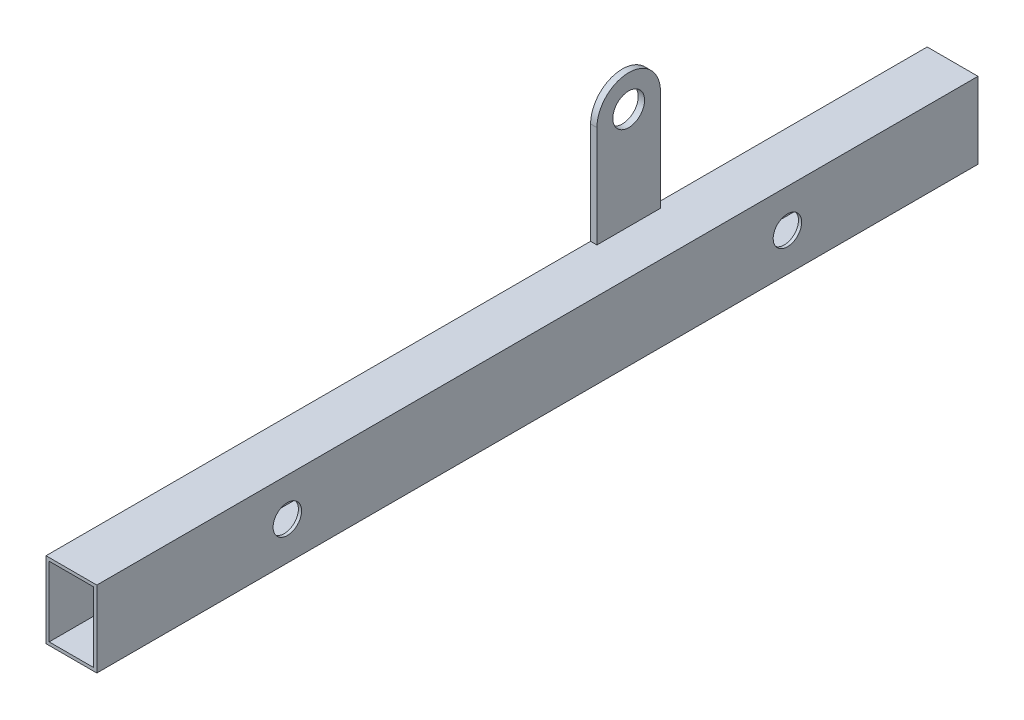
ISO-10303-21;
HEADER;
FILE_DESCRIPTION(('STEP AP214'),'2;1');
FILE_NAME('part.step','',(''),(''),'','','');
FILE_SCHEMA(('AUTOMOTIVE_DESIGN { 1 0 10303 214 1 1 1 1 }'));
ENDSEC;
DATA;
#1=APPLICATION_CONTEXT('core data for automotive mechanical design processes');
#2=APPLICATION_PROTOCOL_DEFINITION('international standard','automotive_design',2000,#1);
#3=PRODUCT_CONTEXT('',#1,'mechanical');
#4=PRODUCT('Part','Part','',(#3));
#5=PRODUCT_RELATED_PRODUCT_CATEGORY('part','',(#4));
#6=PRODUCT_DEFINITION_FORMATION('','',#4);
#7=PRODUCT_DEFINITION_CONTEXT('part definition',#1,'design');
#8=PRODUCT_DEFINITION('design','',#6,#7);
#9=PRODUCT_DEFINITION_SHAPE('','',#8);
#10=(LENGTH_UNIT() NAMED_UNIT(*) SI_UNIT(.MILLI.,.METRE.));
#11=(NAMED_UNIT(*) PLANE_ANGLE_UNIT() SI_UNIT($,.RADIAN.));
#12=(NAMED_UNIT(*) SI_UNIT($,.STERADIAN.) SOLID_ANGLE_UNIT());
#13=UNCERTAINTY_MEASURE_WITH_UNIT(LENGTH_MEASURE(1.E-05),#10,'distance_accuracy_value','');
#14=(GEOMETRIC_REPRESENTATION_CONTEXT(3) GLOBAL_UNCERTAINTY_ASSIGNED_CONTEXT((#13)) GLOBAL_UNIT_ASSIGNED_CONTEXT((#10,
#11,#12)) REPRESENTATION_CONTEXT('',''));
#15=CARTESIAN_POINT('',(0.,0.,0.));
#16=DIRECTION('',(0.,0.,1.));
#17=DIRECTION('',(1.,0.,0.));
#18=AXIS2_PLACEMENT_3D('',#15,#16,#17);
#19=CARTESIAN_POINT('',(-25.4,38.1,965.2));
#20=DIRECTION('',(0.,-1.,0.));
#21=DIRECTION('',(0.,0.,-1.));
#22=AXIS2_PLACEMENT_3D('',#19,#20,#21);
#23=PLANE('',#22);
#24=DIRECTION('',(-1.,0.,0.));
#25=VECTOR('',#24,1.);
#26=CARTESIAN_POINT('',(-19.05,38.1,273.05));
#27=LINE('',#26,#25);
#28=CARTESIAN_POINT('',(-19.05,38.1,273.05));
#29=VERTEX_POINT('',#28);
#30=CARTESIAN_POINT('',(-25.4,38.1,273.05));
#31=VERTEX_POINT('',#30);
#32=EDGE_CURVE('E148',#29,#31,#27,.T.);
#33=ORIENTED_EDGE('',*,*,#32,.F.);
#34=DIRECTION('',(0.,0.,1.));
#35=VECTOR('',#34,1.);
#36=CARTESIAN_POINT('',(-19.05,38.1,336.55));
#37=LINE('',#36,#35);
#38=CARTESIAN_POINT('',(-19.05,38.1,336.55));
#39=VERTEX_POINT('',#38);
#40=EDGE_CURVE('E158',#29,#39,#37,.T.);
#41=ORIENTED_EDGE('',*,*,#40,.T.);
#42=DIRECTION('',(-1.,0.,0.));
#43=VECTOR('',#42,1.);
#44=CARTESIAN_POINT('',(-19.05,38.1,336.55));
#45=LINE('',#44,#43);
#46=CARTESIAN_POINT('',(-25.4,38.1,336.55));
#47=VERTEX_POINT('',#46);
#48=EDGE_CURVE('E176',#39,#47,#45,.T.);
#49=ORIENTED_EDGE('',*,*,#48,.T.);
#50=DIRECTION('',(0.,0.,-1.));
#51=VECTOR('',#50,1.);
#52=CARTESIAN_POINT('',(-25.4,38.1,965.2));
#53=LINE('',#52,#51);
#54=CARTESIAN_POINT('',(-25.4,38.1,881.048048410685));
#55=VERTEX_POINT('',#54);
#56=EDGE_CURVE('E295',#55,#47,#53,.T.);
#57=ORIENTED_EDGE('',*,*,#56,.F.);
#58=DIRECTION('',(1.,0.,0.));
#59=VECTOR('',#58,1.);
#60=CARTESIAN_POINT('',(-138.925287739298,38.1,881.048048410685));
#61=LINE('',#60,#59);
#62=CARTESIAN_POINT('',(25.4,38.1,881.048048410685));
#63=VERTEX_POINT('',#62);
#64=EDGE_CURVE('E183',#55,#63,#61,.T.);
#65=ORIENTED_EDGE('',*,*,#64,.T.);
#66=DIRECTION('',(0.,0.,-1.));
#67=VECTOR('',#66,1.);
#68=CARTESIAN_POINT('',(25.4,38.1,965.2));
#69=LINE('',#68,#67);
#70=CARTESIAN_POINT('',(25.4,38.1,0.));
#71=VERTEX_POINT('',#70);
#72=EDGE_CURVE('E45',#63,#71,#69,.T.);
#73=ORIENTED_EDGE('',*,*,#72,.T.);
#74=DIRECTION('',(-1.,0.,0.));
#75=VECTOR('',#74,1.);
#76=CARTESIAN_POINT('',(-25.4,38.1,0.));
#77=LINE('',#76,#75);
#78=CARTESIAN_POINT('',(-25.4,38.1,0.));
#79=VERTEX_POINT('',#78);
#80=EDGE_CURVE('E281',#71,#79,#77,.T.);
#81=ORIENTED_EDGE('',*,*,#80,.T.);
#82=EDGE_CURVE('E294',#31,#79,#53,.T.);
#83=ORIENTED_EDGE('',*,*,#82,.F.);
#84=EDGE_LOOP('',(#33,#41,#49,#57,#65,#73,#81,#83));
#85=FACE_BOUND('',#84,.T.);
#86=ADVANCED_FACE('F37',(#85),#23,.F.);
#87=CARTESIAN_POINT('',(0.,0.,0.));
#88=DIRECTION('',(0.,0.,1.));
#89=DIRECTION('',(1.,0.,0.));
#90=AXIS2_PLACEMENT_3D('',#87,#88,#89);
#91=PLANE('',#90);
#92=DIRECTION('',(0.,1.,0.));
#93=VECTOR('',#92,1.);
#94=CARTESIAN_POINT('',(25.4,38.1,0.));
#95=LINE('',#94,#93);
#96=CARTESIAN_POINT('',(25.4,-38.1,0.));
#97=VERTEX_POINT('',#96);
#98=EDGE_CURVE('E277',#97,#71,#95,.T.);
#99=ORIENTED_EDGE('',*,*,#98,.F.);
#100=DIRECTION('',(1.,0.,0.));
#101=VECTOR('',#100,1.);
#102=CARTESIAN_POINT('',(-25.3999999999999,-38.1,0.));
#103=LINE('',#102,#101);
#104=CARTESIAN_POINT('',(-25.3999999999999,-38.1,0.));
#105=VERTEX_POINT('',#104);
#106=EDGE_CURVE('E287',#105,#97,#103,.T.);
#107=ORIENTED_EDGE('',*,*,#106,.F.);
#108=DIRECTION('',(0.,-1.,0.));
#109=VECTOR('',#108,1.);
#110=CARTESIAN_POINT('',(-25.4,38.1,0.));
#111=LINE('',#110,#109);
#112=EDGE_CURVE('E284',#79,#105,#111,.T.);
#113=ORIENTED_EDGE('',*,*,#112,.F.);
#114=ORIENTED_EDGE('',*,*,#80,.F.);
#115=EDGE_LOOP('',(#99,#107,#113,#114));
#116=FACE_BOUND('',#115,.T.);
#117=DIRECTION('',(0.,-1.,0.));
#118=VECTOR('',#117,1.);
#119=CARTESIAN_POINT('',(-22.225,34.925,0.));
#120=LINE('',#119,#118);
#121=CARTESIAN_POINT('',(-22.225,34.925,0.));
#122=VERTEX_POINT('',#121);
#123=CARTESIAN_POINT('',(-22.225,-34.925,0.));
#124=VERTEX_POINT('',#123);
#125=EDGE_CURVE('E254',#122,#124,#120,.T.);
#126=ORIENTED_EDGE('',*,*,#125,.T.);
#127=DIRECTION('',(1.,0.,0.));
#128=VECTOR('',#127,1.);
#129=CARTESIAN_POINT('',(-22.225,-34.925,0.));
#130=LINE('',#129,#128);
#131=CARTESIAN_POINT('',(22.225,-34.925,0.));
#132=VERTEX_POINT('',#131);
#133=EDGE_CURVE('E257',#124,#132,#130,.T.);
#134=ORIENTED_EDGE('',*,*,#133,.T.);
#135=DIRECTION('',(0.,1.,0.));
#136=VECTOR('',#135,1.);
#137=CARTESIAN_POINT('',(22.225,34.925,0.));
#138=LINE('',#137,#136);
#139=CARTESIAN_POINT('',(22.225,34.925,0.));
#140=VERTEX_POINT('',#139);
#141=EDGE_CURVE('E260',#132,#140,#138,.T.);
#142=ORIENTED_EDGE('',*,*,#141,.T.);
#143=DIRECTION('',(-1.,0.,0.));
#144=VECTOR('',#143,1.);
#145=CARTESIAN_POINT('',(-22.225,34.925,0.));
#146=LINE('',#145,#144);
#147=EDGE_CURVE('E263',#140,#122,#146,.T.);
#148=ORIENTED_EDGE('',*,*,#147,.T.);
#149=EDGE_LOOP('',(#126,#134,#142,#148));
#150=FACE_BOUND('',#149,.T.);
#151=ADVANCED_FACE('F325',(#116,#150),#91,.F.);
#152=CARTESIAN_POINT('',(25.4,38.1,965.2));
#153=DIRECTION('',(-1.,0.,0.));
#154=DIRECTION('',(0.,-1.,0.));
#155=AXIS2_PLACEMENT_3D('',#152,#153,#154);
#156=PLANE('',#155);
#157=CARTESIAN_POINT('',(25.4,0.,190.549048410685));
#158=DIRECTION('',(1.,0.,0.));
#159=DIRECTION('',(0.,1.,0.));
#160=AXIS2_PLACEMENT_3D('',#157,#158,#159);
#161=CIRCLE('',#160,14.224);
#162=CARTESIAN_POINT('',(25.4,14.224,190.549048410685));
#163=VERTEX_POINT('',#162);
#164=EDGE_CURVE('E235',#163,#163,#161,.T.);
#165=ORIENTED_EDGE('',*,*,#164,.F.);
#166=EDGE_LOOP('',(#165));
#167=FACE_BOUND('',#166,.T.);
#168=CARTESIAN_POINT('',(25.4,0.,690.548048410685));
#169=DIRECTION('',(1.,0.,0.));
#170=DIRECTION('',(0.,1.,0.));
#171=AXIS2_PLACEMENT_3D('',#168,#169,#170);
#172=CIRCLE('',#171,14.2240000000001);
#173=CARTESIAN_POINT('',(25.4,14.224,690.548048410685));
#174=VERTEX_POINT('',#173);
#175=EDGE_CURVE('E239',#174,#174,#172,.T.);
#176=ORIENTED_EDGE('',*,*,#175,.F.);
#177=EDGE_LOOP('',(#176));
#178=FACE_BOUND('',#177,.T.);
#179=ORIENTED_EDGE('',*,*,#72,.F.);
#180=DIRECTION('',(0.,1.,0.));
#181=VECTOR('',#180,1.);
#182=CARTESIAN_POINT('',(25.4,38.1,881.048048410685));
#183=LINE('',#182,#181);
#184=CARTESIAN_POINT('',(25.4,-38.1,881.048048410685));
#185=VERTEX_POINT('',#184);
#186=EDGE_CURVE('E175',#185,#63,#183,.T.);
#187=ORIENTED_EDGE('',*,*,#186,.F.);
#188=DIRECTION('',(0.,0.,-1.));
#189=VECTOR('',#188,1.);
#190=CARTESIAN_POINT('',(25.4,-38.1,965.2));
#191=LINE('',#190,#189);
#192=EDGE_CURVE('E290',#185,#97,#191,.T.);
#193=ORIENTED_EDGE('',*,*,#192,.T.);
#194=ORIENTED_EDGE('',*,*,#98,.T.);
#195=EDGE_LOOP('',(#179,#187,#193,#194));
#196=FACE_BOUND('',#195,.T.);
#197=ADVANCED_FACE('F39',(#167,#178,#196),#156,.F.);
#198=CARTESIAN_POINT('',(-25.4,38.1,965.2));
#199=DIRECTION('',(1.,0.,0.));
#200=DIRECTION('',(0.,1.,0.));
#201=AXIS2_PLACEMENT_3D('',#198,#199,#200);
#202=PLANE('',#201);
#203=CARTESIAN_POINT('',(-25.4,0.,190.549048410685));
#204=DIRECTION('',(1.,0.,0.));
#205=DIRECTION('',(0.,1.,0.));
#206=AXIS2_PLACEMENT_3D('',#203,#204,#205);
#207=CIRCLE('',#206,14.224);
#208=CARTESIAN_POINT('',(-25.4,14.224,190.549048410685));
#209=VERTEX_POINT('',#208);
#210=EDGE_CURVE('E238',#209,#209,#207,.F.);
#211=ORIENTED_EDGE('',*,*,#210,.F.);
#212=EDGE_LOOP('',(#211));
#213=FACE_BOUND('',#212,.T.);
#214=CARTESIAN_POINT('',(-25.4,0.,690.548048410685));
#215=DIRECTION('',(1.,0.,0.));
#216=DIRECTION('',(0.,1.,0.));
#217=AXIS2_PLACEMENT_3D('',#214,#215,#216);
#218=CIRCLE('',#217,14.2240000000001);
#219=CARTESIAN_POINT('',(-25.4,14.224,690.548048410685));
#220=VERTEX_POINT('',#219);
#221=EDGE_CURVE('E234',#220,#220,#218,.F.);
#222=ORIENTED_EDGE('',*,*,#221,.F.);
#223=EDGE_LOOP('',(#222));
#224=FACE_BOUND('',#223,.T.);
#225=DIRECTION('',(0.,0.,-1.));
#226=VECTOR('',#225,1.);
#227=CARTESIAN_POINT('',(-25.3999999999999,-38.1,965.2));
#228=LINE('',#227,#226);
#229=CARTESIAN_POINT('',(-25.3999999999999,-38.1,881.048048410685));
#230=VERTEX_POINT('',#229);
#231=EDGE_CURVE('E292',#230,#105,#228,.T.);
#232=ORIENTED_EDGE('',*,*,#231,.F.);
#233=DIRECTION('',(0.,-1.,0.));
#234=VECTOR('',#233,1.);
#235=CARTESIAN_POINT('',(-25.4,38.1,881.048048410685));
#236=LINE('',#235,#234);
#237=EDGE_CURVE('E60',#55,#230,#236,.T.);
#238=ORIENTED_EDGE('',*,*,#237,.F.);
#239=ORIENTED_EDGE('',*,*,#56,.T.);
#240=DIRECTION('',(0.,1.,0.));
#241=VECTOR('',#240,1.);
#242=CARTESIAN_POINT('',(-25.4,139.7,336.55));
#243=LINE('',#242,#241);
#244=CARTESIAN_POINT('',(-25.4,139.7,336.55));
#245=VERTEX_POINT('',#244);
#246=EDGE_CURVE('E52',#47,#245,#243,.T.);
#247=ORIENTED_EDGE('',*,*,#246,.T.);
#248=CARTESIAN_POINT('',(-25.4,139.7,304.8));
#249=DIRECTION('',(-1.,0.,0.));
#250=DIRECTION('',(0.,-1.,0.));
#251=AXIS2_PLACEMENT_3D('',#248,#249,#250);
#252=CIRCLE('',#251,31.75);
#253=CARTESIAN_POINT('',(-25.4,139.7,273.05));
#254=VERTEX_POINT('',#253);
#255=EDGE_CURVE('E170',#245,#254,#252,.T.);
#256=ORIENTED_EDGE('',*,*,#255,.T.);
#257=DIRECTION('',(0.,-1.,0.));
#258=VECTOR('',#257,1.);
#259=CARTESIAN_POINT('',(-25.4,38.1,273.05));
#260=LINE('',#259,#258);
#261=EDGE_CURVE('E143',#254,#31,#260,.T.);
#262=ORIENTED_EDGE('',*,*,#261,.T.);
#263=ORIENTED_EDGE('',*,*,#82,.T.);
#264=ORIENTED_EDGE('',*,*,#112,.T.);
#265=EDGE_LOOP('',(#232,#238,#239,#247,#256,#262,#263,#264));
#266=FACE_BOUND('',#265,.T.);
#267=CARTESIAN_POINT('',(-25.4,139.7,304.8));
#268=DIRECTION('',(-1.,0.,0.));
#269=DIRECTION('',(0.,-1.,0.));
#270=AXIS2_PLACEMENT_3D('',#267,#268,#269);
#271=CIRCLE('',#270,15.875);
#272=CARTESIAN_POINT('',(-25.4,123.825,304.8));
#273=VERTEX_POINT('',#272);
#274=EDGE_CURVE('E165',#273,#273,#271,.T.);
#275=ORIENTED_EDGE('',*,*,#274,.F.);
#276=EDGE_LOOP('',(#275));
#277=FACE_BOUND('',#276,.T.);
#278=ADVANCED_FACE('F324',(#213,#224,#266,#277),#202,.F.);
#279=CARTESIAN_POINT('',(-25.3999999999999,-38.1,965.2));
#280=DIRECTION('',(0.,1.,0.));
#281=DIRECTION('',(0.,0.,1.));
#282=AXIS2_PLACEMENT_3D('',#279,#280,#281);
#283=PLANE('',#282);
#284=CARTESIAN_POINT('',(0.,-38.1,495.808));
#285=DIRECTION('',(0.,-1.,0.));
#286=DIRECTION('',(0.,0.,-1.));
#287=AXIS2_PLACEMENT_3D('',#284,#285,#286);
#288=CIRCLE('',#287,3.175);
#289=CARTESIAN_POINT('',(0.,-38.1,492.633));
#290=VERTEX_POINT('',#289);
#291=EDGE_CURVE('E192',#290,#290,#288,.T.);
#292=ORIENTED_EDGE('',*,*,#291,.F.);
#293=EDGE_LOOP('',(#292));
#294=FACE_BOUND('',#293,.T.);
#295=CARTESIAN_POINT('',(0.,-38.1,580.898));
#296=DIRECTION('',(0.,-1.,0.));
#297=DIRECTION('',(0.,0.,-1.));
#298=AXIS2_PLACEMENT_3D('',#295,#296,#297);
#299=CIRCLE('',#298,3.175);
#300=CARTESIAN_POINT('',(0.,-38.1,577.723));
#301=VERTEX_POINT('',#300);
#302=EDGE_CURVE('E219',#301,#301,#299,.T.);
#303=ORIENTED_EDGE('',*,*,#302,.F.);
#304=EDGE_LOOP('',(#303));
#305=FACE_BOUND('',#304,.T.);
#306=CARTESIAN_POINT('',(-19.0499999999999,-38.1,289.56));
#307=DIRECTION('',(0.,-1.,0.));
#308=DIRECTION('',(0.,0.,-1.));
#309=AXIS2_PLACEMENT_3D('',#306,#307,#308);
#310=CIRCLE('',#309,3.175);
#311=CARTESIAN_POINT('',(-19.0499999999999,-38.1,286.385));
#312=VERTEX_POINT('',#311);
#313=EDGE_CURVE('E207',#312,#312,#310,.T.);
#314=ORIENTED_EDGE('',*,*,#313,.F.);
#315=EDGE_LOOP('',(#314));
#316=FACE_BOUND('',#315,.T.);
#317=CARTESIAN_POINT('',(19.05,-38.1,276.86));
#318=DIRECTION('',(0.,-1.,0.));
#319=DIRECTION('',(0.,0.,1.));
#320=AXIS2_PLACEMENT_3D('',#317,#318,#319);
#321=CIRCLE('',#320,3.175);
#322=CARTESIAN_POINT('',(19.05,-38.1,280.035));
#323=VERTEX_POINT('',#322);
#324=EDGE_CURVE('E200',#323,#323,#321,.T.);
#325=ORIENTED_EDGE('',*,*,#324,.F.);
#326=EDGE_LOOP('',(#325));
#327=FACE_BOUND('',#326,.T.);
#328=CARTESIAN_POINT('',(19.0499999999999,-38.1,289.56));
#329=DIRECTION('',(0.,-1.,0.));
#330=DIRECTION('',(0.,0.,1.));
#331=AXIS2_PLACEMENT_3D('',#328,#329,#330);
#332=CIRCLE('',#331,3.175);
#333=CARTESIAN_POINT('',(19.0499999999999,-38.1,292.735));
#334=VERTEX_POINT('',#333);
#335=EDGE_CURVE('E193',#334,#334,#332,.T.);
#336=ORIENTED_EDGE('',*,*,#335,.F.);
#337=EDGE_LOOP('',(#336));
#338=FACE_BOUND('',#337,.T.);
#339=CARTESIAN_POINT('',(0.,-38.1,410.718));
#340=DIRECTION('',(0.,-1.,0.));
#341=DIRECTION('',(0.,0.,-1.));
#342=AXIS2_PLACEMENT_3D('',#339,#340,#341);
#343=CIRCLE('',#342,3.175);
#344=CARTESIAN_POINT('',(0.,-38.1,407.543));
#345=VERTEX_POINT('',#344);
#346=EDGE_CURVE('E201',#345,#345,#343,.T.);
#347=ORIENTED_EDGE('',*,*,#346,.F.);
#348=EDGE_LOOP('',(#347));
#349=FACE_BOUND('',#348,.T.);
#350=CARTESIAN_POINT('',(-19.05,-38.1,276.86));
#351=DIRECTION('',(0.,-1.,0.));
#352=DIRECTION('',(0.,0.,-1.));
#353=AXIS2_PLACEMENT_3D('',#350,#351,#352);
#354=CIRCLE('',#353,3.175);
#355=CARTESIAN_POINT('',(-19.05,-38.1,273.685));
#356=VERTEX_POINT('',#355);
#357=EDGE_CURVE('E214',#356,#356,#354,.T.);
#358=ORIENTED_EDGE('',*,*,#357,.F.);
#359=EDGE_LOOP('',(#358));
#360=FACE_BOUND('',#359,.T.);
#361=ORIENTED_EDGE('',*,*,#192,.F.);
#362=DIRECTION('',(1.,0.,0.));
#363=VECTOR('',#362,1.);
#364=CARTESIAN_POINT('',(-138.925287739298,-38.1,881.048048410685));
#365=LINE('',#364,#363);
#366=EDGE_CURVE('E181',#230,#185,#365,.T.);
#367=ORIENTED_EDGE('',*,*,#366,.F.);
#368=ORIENTED_EDGE('',*,*,#231,.T.);
#369=ORIENTED_EDGE('',*,*,#106,.T.);
#370=EDGE_LOOP('',(#361,#367,#368,#369));
#371=FACE_BOUND('',#370,.T.);
#372=ADVANCED_FACE('F363',(#294,#305,#316,#327,#338,#349,#360,#371),#283,.F.);
#373=CARTESIAN_POINT('',(-22.225,34.925,965.2));
#374=DIRECTION('',(1.,0.,0.));
#375=DIRECTION('',(0.,1.,0.));
#376=AXIS2_PLACEMENT_3D('',#373,#374,#375);
#377=PLANE('',#376);
#378=DIRECTION('',(0.,1.,0.));
#379=VECTOR('',#378,1.);
#380=CARTESIAN_POINT('',(-22.225,34.925,881.048048410685));
#381=LINE('',#380,#379);
#382=CARTESIAN_POINT('',(-22.225,-34.925,881.048048410685));
#383=VERTEX_POINT('',#382);
#384=CARTESIAN_POINT('',(-22.225,34.925,881.048048410685));
#385=VERTEX_POINT('',#384);
#386=EDGE_CURVE('E190',#383,#385,#381,.T.);
#387=ORIENTED_EDGE('',*,*,#386,.F.);
#388=DIRECTION('',(0.,0.,-1.));
#389=VECTOR('',#388,1.);
#390=CARTESIAN_POINT('',(-22.225,-34.925,965.2));
#391=LINE('',#390,#389);
#392=CARTESIAN_POINT('',(-22.225,-34.925,289.56));
#393=VERTEX_POINT('',#392);
#394=EDGE_CURVE('E275',#383,#393,#391,.T.);
#395=ORIENTED_EDGE('',*,*,#394,.T.);
#396=CARTESIAN_POINT('',(-22.225,-34.925,276.86));
#397=VERTEX_POINT('',#396);
#398=EDGE_CURVE('E278',#393,#397,#391,.T.);
#399=ORIENTED_EDGE('',*,*,#398,.T.);
#400=EDGE_CURVE('E273',#397,#124,#391,.T.);
#401=ORIENTED_EDGE('',*,*,#400,.T.);
#402=ORIENTED_EDGE('',*,*,#125,.F.);
#403=DIRECTION('',(0.,0.,-1.));
#404=VECTOR('',#403,1.);
#405=CARTESIAN_POINT('',(-22.225,34.925,965.2));
#406=LINE('',#405,#404);
#407=EDGE_CURVE('E266',#385,#122,#406,.T.);
#408=ORIENTED_EDGE('',*,*,#407,.F.);
#409=EDGE_LOOP('',(#387,#395,#399,#401,#402,#408));
#410=FACE_BOUND('',#409,.T.);
#411=CARTESIAN_POINT('',(-22.225,0.,190.549048410685));
#412=DIRECTION('',(1.,0.,0.));
#413=DIRECTION('',(0.,1.,0.));
#414=AXIS2_PLACEMENT_3D('',#411,#412,#413);
#415=CIRCLE('',#414,14.224);
#416=CARTESIAN_POINT('',(-22.225,14.224,190.549048410685));
#417=VERTEX_POINT('',#416);
#418=EDGE_CURVE('E251',#417,#417,#415,.T.);
#419=ORIENTED_EDGE('',*,*,#418,.F.);
#420=EDGE_LOOP('',(#419));
#421=FACE_BOUND('',#420,.T.);
#422=CARTESIAN_POINT('',(-22.225,0.,690.548048410685));
#423=DIRECTION('',(1.,0.,0.));
#424=DIRECTION('',(0.,1.,0.));
#425=AXIS2_PLACEMENT_3D('',#422,#423,#424);
#426=CIRCLE('',#425,14.2240000000001);
#427=CARTESIAN_POINT('',(-22.225,14.224,690.548048410685));
#428=VERTEX_POINT('',#427);
#429=EDGE_CURVE('E247',#428,#428,#426,.T.);
#430=ORIENTED_EDGE('',*,*,#429,.F.);
#431=EDGE_LOOP('',(#430));
#432=FACE_BOUND('',#431,.T.);
#433=ADVANCED_FACE('F366',(#410,#421,#432),#377,.T.);
#434=CARTESIAN_POINT('',(-22.225,-34.925,965.2));
#435=DIRECTION('',(0.,1.,0.));
#436=DIRECTION('',(-1.,0.,0.));
#437=AXIS2_PLACEMENT_3D('',#434,#435,#436);
#438=PLANE('',#437);
#439=DIRECTION('',(-1.,0.,0.));
#440=VECTOR('',#439,1.);
#441=CARTESIAN_POINT('',(-22.225,-34.925,881.048048410685));
#442=LINE('',#441,#440);
#443=CARTESIAN_POINT('',(22.225,-34.925,881.048048410685));
#444=VERTEX_POINT('',#443);
#445=EDGE_CURVE('E188',#444,#383,#442,.T.);
#446=ORIENTED_EDGE('',*,*,#445,.F.);
#447=DIRECTION('',(0.,0.,-1.));
#448=VECTOR('',#447,1.);
#449=CARTESIAN_POINT('',(22.225,-34.925,965.2));
#450=LINE('',#449,#448);
#451=CARTESIAN_POINT('',(22.225,-34.925,289.56));
#452=VERTEX_POINT('',#451);
#453=EDGE_CURVE('E271',#444,#452,#450,.T.);
#454=ORIENTED_EDGE('',*,*,#453,.T.);
#455=CARTESIAN_POINT('',(19.0499999999999,-34.925,289.56));
#456=DIRECTION('',(0.,1.,0.));
#457=DIRECTION('',(-1.,0.,0.));
#458=AXIS2_PLACEMENT_3D('',#455,#456,#457);
#459=CIRCLE('',#458,3.175);
#460=EDGE_CURVE('E196',#452,#452,#459,.F.);
#461=ORIENTED_EDGE('',*,*,#460,.T.);
#462=CARTESIAN_POINT('',(22.225,-34.925,276.86));
#463=VERTEX_POINT('',#462);
#464=EDGE_CURVE('E274',#452,#463,#450,.T.);
#465=ORIENTED_EDGE('',*,*,#464,.T.);
#466=CARTESIAN_POINT('',(19.05,-34.925,276.86));
#467=DIRECTION('',(0.,1.,0.));
#468=DIRECTION('',(-1.,0.,0.));
#469=AXIS2_PLACEMENT_3D('',#466,#467,#468);
#470=CIRCLE('',#469,3.175);
#471=EDGE_CURVE('E211',#463,#463,#470,.F.);
#472=ORIENTED_EDGE('',*,*,#471,.T.);
#473=EDGE_CURVE('E270',#463,#132,#450,.T.);
#474=ORIENTED_EDGE('',*,*,#473,.T.);
#475=ORIENTED_EDGE('',*,*,#133,.F.);
#476=ORIENTED_EDGE('',*,*,#400,.F.);
#477=CARTESIAN_POINT('',(-19.05,-34.925,276.86));
#478=DIRECTION('',(0.,1.,0.));
#479=DIRECTION('',(-1.,0.,0.));
#480=AXIS2_PLACEMENT_3D('',#477,#478,#479);
#481=CIRCLE('',#480,3.175);
#482=EDGE_CURVE('E231',#397,#397,#481,.F.);
#483=ORIENTED_EDGE('',*,*,#482,.T.);
#484=ORIENTED_EDGE('',*,*,#398,.F.);
#485=CARTESIAN_POINT('',(-19.0499999999999,-34.925,289.56));
#486=DIRECTION('',(0.,1.,0.));
#487=DIRECTION('',(-1.,0.,0.));
#488=AXIS2_PLACEMENT_3D('',#485,#486,#487);
#489=CIRCLE('',#488,3.175);
#490=EDGE_CURVE('E210',#393,#393,#489,.F.);
#491=ORIENTED_EDGE('',*,*,#490,.T.);
#492=ORIENTED_EDGE('',*,*,#394,.F.);
#493=EDGE_LOOP('',(#446,#454,#461,#465,#472,#474,#475,#476,#483,#484,#491,#492));
#494=FACE_BOUND('',#493,.T.);
#495=CARTESIAN_POINT('',(0.,-34.925,495.808));
#496=DIRECTION('',(0.,1.,0.));
#497=DIRECTION('',(-1.,0.,0.));
#498=AXIS2_PLACEMENT_3D('',#495,#496,#497);
#499=CIRCLE('',#498,3.175);
#500=CARTESIAN_POINT('',(-3.175,-34.925,495.808));
#501=VERTEX_POINT('',#500);
#502=EDGE_CURVE('E222',#501,#501,#499,.F.);
#503=ORIENTED_EDGE('',*,*,#502,.T.);
#504=EDGE_LOOP('',(#503));
#505=FACE_BOUND('',#504,.T.);
#506=CARTESIAN_POINT('',(0.,-34.925,580.898));
#507=DIRECTION('',(0.,1.,0.));
#508=DIRECTION('',(-1.,0.,0.));
#509=AXIS2_PLACEMENT_3D('',#506,#507,#508);
#510=CIRCLE('',#509,3.175);
#511=CARTESIAN_POINT('',(-3.175,-34.925,580.898));
#512=VERTEX_POINT('',#511);
#513=EDGE_CURVE('E204',#512,#512,#510,.F.);
#514=ORIENTED_EDGE('',*,*,#513,.T.);
#515=EDGE_LOOP('',(#514));
#516=FACE_BOUND('',#515,.T.);
#517=CARTESIAN_POINT('',(0.,-34.925,410.718));
#518=DIRECTION('',(0.,1.,0.));
#519=DIRECTION('',(-1.,0.,0.));
#520=AXIS2_PLACEMENT_3D('',#517,#518,#519);
#521=CIRCLE('',#520,3.175);
#522=CARTESIAN_POINT('',(-3.175,-34.925,410.718));
#523=VERTEX_POINT('',#522);
#524=EDGE_CURVE('E197',#523,#523,#521,.F.);
#525=ORIENTED_EDGE('',*,*,#524,.T.);
#526=EDGE_LOOP('',(#525));
#527=FACE_BOUND('',#526,.T.);
#528=ADVANCED_FACE('F310',(#494,#505,#516,#527),#438,.T.);
#529=CARTESIAN_POINT('',(22.225,34.925,965.2));
#530=DIRECTION('',(-1.,0.,0.));
#531=DIRECTION('',(0.,-1.,0.));
#532=AXIS2_PLACEMENT_3D('',#529,#530,#531);
#533=PLANE('',#532);
#534=DIRECTION('',(0.,-1.,0.));
#535=VECTOR('',#534,1.);
#536=CARTESIAN_POINT('',(22.225,34.925,881.048048410685));
#537=LINE('',#536,#535);
#538=CARTESIAN_POINT('',(22.225,34.925,881.048048410685));
#539=VERTEX_POINT('',#538);
#540=EDGE_CURVE('E180',#539,#444,#537,.T.);
#541=ORIENTED_EDGE('',*,*,#540,.F.);
#542=DIRECTION('',(0.,0.,-1.));
#543=VECTOR('',#542,1.);
#544=CARTESIAN_POINT('',(22.225,34.925,965.2));
#545=LINE('',#544,#543);
#546=EDGE_CURVE('E268',#539,#140,#545,.T.);
#547=ORIENTED_EDGE('',*,*,#546,.T.);
#548=ORIENTED_EDGE('',*,*,#141,.F.);
#549=ORIENTED_EDGE('',*,*,#473,.F.);
#550=ORIENTED_EDGE('',*,*,#464,.F.);
#551=ORIENTED_EDGE('',*,*,#453,.F.);
#552=EDGE_LOOP('',(#541,#547,#548,#549,#550,#551));
#553=FACE_BOUND('',#552,.T.);
#554=CARTESIAN_POINT('',(22.225,0.,190.549048410685));
#555=DIRECTION('',(-1.,0.,0.));
#556=DIRECTION('',(0.,-1.,0.));
#557=AXIS2_PLACEMENT_3D('',#554,#555,#556);
#558=CIRCLE('',#557,14.224);
#559=CARTESIAN_POINT('',(22.225,-14.224,190.549048410685));
#560=VERTEX_POINT('',#559);
#561=EDGE_CURVE('E250',#560,#560,#558,.T.);
#562=ORIENTED_EDGE('',*,*,#561,.F.);
#563=EDGE_LOOP('',(#562));
#564=FACE_BOUND('',#563,.T.);
#565=CARTESIAN_POINT('',(22.225,0.,690.548048410685));
#566=DIRECTION('',(-1.,0.,0.));
#567=DIRECTION('',(0.,-1.,0.));
#568=AXIS2_PLACEMENT_3D('',#565,#566,#567);
#569=CIRCLE('',#568,14.2240000000001);
#570=CARTESIAN_POINT('',(22.225,-14.2240000000001,690.548048410685));
#571=VERTEX_POINT('',#570);
#572=EDGE_CURVE('E242',#571,#571,#569,.T.);
#573=ORIENTED_EDGE('',*,*,#572,.F.);
#574=EDGE_LOOP('',(#573));
#575=FACE_BOUND('',#574,.T.);
#576=ADVANCED_FACE('F306',(#553,#564,#575),#533,.T.);
#577=CARTESIAN_POINT('',(-22.225,34.925,965.2));
#578=DIRECTION('',(0.,-1.,0.));
#579=DIRECTION('',(1.,0.,0.));
#580=AXIS2_PLACEMENT_3D('',#577,#578,#579);
#581=PLANE('',#580);
#582=DIRECTION('',(1.,0.,0.));
#583=VECTOR('',#582,1.);
#584=CARTESIAN_POINT('',(-22.225,34.925,881.048048410685));
#585=LINE('',#584,#583);
#586=EDGE_CURVE('E11',#385,#539,#585,.T.);
#587=ORIENTED_EDGE('',*,*,#586,.F.);
#588=ORIENTED_EDGE('',*,*,#407,.T.);
#589=ORIENTED_EDGE('',*,*,#147,.F.);
#590=ORIENTED_EDGE('',*,*,#546,.F.);
#591=EDGE_LOOP('',(#587,#588,#589,#590));
#592=FACE_BOUND('',#591,.T.);
#593=ADVANCED_FACE('F309',(#592),#581,.T.);
#594=CARTESIAN_POINT('',(-65.6315474223899,0.,690.548048410685));
#595=DIRECTION('',(1.,0.,0.));
#596=DIRECTION('',(0.,1.,0.));
#597=AXIS2_PLACEMENT_3D('',#594,#595,#596);
#598=CYLINDRICAL_SURFACE('',#597,14.2240000000001);
#599=ORIENTED_EDGE('',*,*,#572,.T.);
#600=EDGE_LOOP('',(#599));
#601=FACE_BOUND('',#600,.T.);
#602=ORIENTED_EDGE('',*,*,#175,.T.);
#603=EDGE_LOOP('',(#602));
#604=FACE_BOUND('',#603,.T.);
#605=ADVANCED_FACE('F315',(#601,#604),#598,.F.);
#606=CARTESIAN_POINT('',(-65.6315474223899,0.,190.549048410685));
#607=DIRECTION('',(1.,0.,0.));
#608=DIRECTION('',(0.,1.,0.));
#609=AXIS2_PLACEMENT_3D('',#606,#607,#608);
#610=CYLINDRICAL_SURFACE('',#609,14.224);
#611=ORIENTED_EDGE('',*,*,#561,.T.);
#612=EDGE_LOOP('',(#611));
#613=FACE_BOUND('',#612,.T.);
#614=ORIENTED_EDGE('',*,*,#164,.T.);
#615=EDGE_LOOP('',(#614));
#616=FACE_BOUND('',#615,.T.);
#617=ADVANCED_FACE('F303',(#613,#616),#610,.F.);
#618=ORIENTED_EDGE('',*,*,#429,.T.);
#619=EDGE_LOOP('',(#618));
#620=FACE_BOUND('',#619,.T.);
#621=ORIENTED_EDGE('',*,*,#221,.T.);
#622=EDGE_LOOP('',(#621));
#623=FACE_BOUND('',#622,.T.);
#624=ADVANCED_FACE('F319',(#620,#623),#598,.F.);
#625=ORIENTED_EDGE('',*,*,#418,.T.);
#626=EDGE_LOOP('',(#625));
#627=FACE_BOUND('',#626,.T.);
#628=ORIENTED_EDGE('',*,*,#210,.T.);
#629=EDGE_LOOP('',(#628));
#630=FACE_BOUND('',#629,.T.);
#631=ADVANCED_FACE('F380',(#627,#630),#610,.F.);
#632=CARTESIAN_POINT('',(-19.05,-25.9447438789308,276.86));
#633=DIRECTION('',(0.,-1.,0.));
#634=DIRECTION('',(0.,0.,-1.));
#635=AXIS2_PLACEMENT_3D('',#632,#633,#634);
#636=CYLINDRICAL_SURFACE('',#635,3.175);
#637=ORIENTED_EDGE('',*,*,#357,.T.);
#638=EDGE_LOOP('',(#637));
#639=FACE_BOUND('',#638,.T.);
#640=ORIENTED_EDGE('',*,*,#482,.F.);
#641=EDGE_LOOP('',(#640));
#642=FACE_BOUND('',#641,.T.);
#643=ADVANCED_FACE('F381',(#639,#642),#636,.F.);
#644=CARTESIAN_POINT('',(0.,-25.9447438789308,410.718));
#645=DIRECTION('',(0.,-1.,0.));
#646=DIRECTION('',(0.,0.,-1.));
#647=AXIS2_PLACEMENT_3D('',#644,#645,#646);
#648=CYLINDRICAL_SURFACE('',#647,3.175);
#649=ORIENTED_EDGE('',*,*,#346,.T.);
#650=EDGE_LOOP('',(#649));
#651=FACE_BOUND('',#650,.T.);
#652=ORIENTED_EDGE('',*,*,#524,.F.);
#653=EDGE_LOOP('',(#652));
#654=FACE_BOUND('',#653,.T.);
#655=ADVANCED_FACE('F384',(#651,#654),#648,.F.);
#656=CARTESIAN_POINT('',(19.0499999999999,-25.9447438789308,289.56));
#657=DIRECTION('',(0.,-1.,0.));
#658=DIRECTION('',(0.,0.,-1.));
#659=AXIS2_PLACEMENT_3D('',#656,#657,#658);
#660=CYLINDRICAL_SURFACE('',#659,3.175);
#661=ORIENTED_EDGE('',*,*,#335,.T.);
#662=EDGE_LOOP('',(#661));
#663=FACE_BOUND('',#662,.T.);
#664=ORIENTED_EDGE('',*,*,#460,.F.);
#665=EDGE_LOOP('',(#664));
#666=FACE_BOUND('',#665,.T.);
#667=ADVANCED_FACE('F398',(#663,#666),#660,.F.);
#668=CARTESIAN_POINT('',(19.05,-25.9447438789308,276.86));
#669=DIRECTION('',(0.,-1.,0.));
#670=DIRECTION('',(0.,0.,-1.));
#671=AXIS2_PLACEMENT_3D('',#668,#669,#670);
#672=CYLINDRICAL_SURFACE('',#671,3.175);
#673=ORIENTED_EDGE('',*,*,#324,.T.);
#674=EDGE_LOOP('',(#673));
#675=FACE_BOUND('',#674,.T.);
#676=ORIENTED_EDGE('',*,*,#471,.F.);
#677=EDGE_LOOP('',(#676));
#678=FACE_BOUND('',#677,.T.);
#679=ADVANCED_FACE('F395',(#675,#678),#672,.F.);
#680=CARTESIAN_POINT('',(-19.0499999999999,-25.9447438789308,289.56));
#681=DIRECTION('',(0.,-1.,0.));
#682=DIRECTION('',(0.,0.,-1.));
#683=AXIS2_PLACEMENT_3D('',#680,#681,#682);
#684=CYLINDRICAL_SURFACE('',#683,3.175);
#685=ORIENTED_EDGE('',*,*,#313,.T.);
#686=EDGE_LOOP('',(#685));
#687=FACE_BOUND('',#686,.T.);
#688=ORIENTED_EDGE('',*,*,#490,.F.);
#689=EDGE_LOOP('',(#688));
#690=FACE_BOUND('',#689,.T.);
#691=ADVANCED_FACE('F393',(#687,#690),#684,.F.);
#692=CARTESIAN_POINT('',(0.,-25.9447438789308,580.898));
#693=DIRECTION('',(0.,-1.,0.));
#694=DIRECTION('',(0.,0.,-1.));
#695=AXIS2_PLACEMENT_3D('',#692,#693,#694);
#696=CYLINDRICAL_SURFACE('',#695,3.175);
#697=ORIENTED_EDGE('',*,*,#302,.T.);
#698=EDGE_LOOP('',(#697));
#699=FACE_BOUND('',#698,.T.);
#700=ORIENTED_EDGE('',*,*,#513,.F.);
#701=EDGE_LOOP('',(#700));
#702=FACE_BOUND('',#701,.T.);
#703=ADVANCED_FACE('F389',(#699,#702),#696,.F.);
#704=CARTESIAN_POINT('',(0.,-25.9447438789308,495.808));
#705=DIRECTION('',(0.,-1.,0.));
#706=DIRECTION('',(0.,0.,-1.));
#707=AXIS2_PLACEMENT_3D('',#704,#705,#706);
#708=CYLINDRICAL_SURFACE('',#707,3.175);
#709=ORIENTED_EDGE('',*,*,#291,.T.);
#710=EDGE_LOOP('',(#709));
#711=FACE_BOUND('',#710,.T.);
#712=ORIENTED_EDGE('',*,*,#502,.F.);
#713=EDGE_LOOP('',(#712));
#714=FACE_BOUND('',#713,.T.);
#715=ADVANCED_FACE('F386',(#711,#714),#708,.F.);
#716=CARTESIAN_POINT('',(-138.925287739298,38.1,881.048048410685));
#717=DIRECTION('',(0.,0.,-1.));
#718=DIRECTION('',(-1.,0.,0.));
#719=AXIS2_PLACEMENT_3D('',#716,#717,#718);
#720=PLANE('',#719);
#721=ORIENTED_EDGE('',*,*,#386,.T.);
#722=ORIENTED_EDGE('',*,*,#586,.T.);
#723=ORIENTED_EDGE('',*,*,#540,.T.);
#724=ORIENTED_EDGE('',*,*,#445,.T.);
#725=EDGE_LOOP('',(#721,#722,#723,#724));
#726=FACE_BOUND('',#725,.T.);
#727=ORIENTED_EDGE('',*,*,#237,.T.);
#728=ORIENTED_EDGE('',*,*,#366,.T.);
#729=ORIENTED_EDGE('',*,*,#186,.T.);
#730=ORIENTED_EDGE('',*,*,#64,.F.);
#731=EDGE_LOOP('',(#727,#728,#729,#730));
#732=FACE_BOUND('',#731,.T.);
#733=ADVANCED_FACE('F350',(#726,#732),#720,.F.);
#734=CARTESIAN_POINT('',(-19.05,139.7,304.8));
#735=DIRECTION('',(-1.,0.,0.));
#736=DIRECTION('',(0.,-1.,0.));
#737=AXIS2_PLACEMENT_3D('',#734,#735,#736);
#738=CYLINDRICAL_SURFACE('',#737,31.75);
#739=ORIENTED_EDGE('',*,*,#255,.F.);
#740=DIRECTION('',(-1.,0.,0.));
#741=VECTOR('',#740,1.);
#742=CARTESIAN_POINT('',(-19.05,139.7,336.55));
#743=LINE('',#742,#741);
#744=CARTESIAN_POINT('',(-19.05,139.7,336.55));
#745=VERTEX_POINT('',#744);
#746=EDGE_CURVE('E161',#745,#245,#743,.T.);
#747=ORIENTED_EDGE('',*,*,#746,.F.);
#748=CARTESIAN_POINT('',(-19.05,139.7,304.8));
#749=DIRECTION('',(-1.,0.,0.));
#750=DIRECTION('',(0.,-1.,0.));
#751=AXIS2_PLACEMENT_3D('',#748,#749,#750);
#752=CIRCLE('',#751,31.75);
#753=CARTESIAN_POINT('',(-19.05,139.7,273.05));
#754=VERTEX_POINT('',#753);
#755=EDGE_CURVE('E155',#745,#754,#752,.T.);
#756=ORIENTED_EDGE('',*,*,#755,.T.);
#757=DIRECTION('',(-1.,0.,0.));
#758=VECTOR('',#757,1.);
#759=CARTESIAN_POINT('',(-19.05,139.7,273.05));
#760=LINE('',#759,#758);
#761=EDGE_CURVE('E137',#754,#254,#760,.T.);
#762=ORIENTED_EDGE('',*,*,#761,.T.);
#763=EDGE_LOOP('',(#739,#747,#756,#762));
#764=FACE_BOUND('',#763,.T.);
#765=ADVANCED_FACE('F160',(#764),#738,.T.);
#766=CARTESIAN_POINT('',(-19.05,139.7,336.55));
#767=DIRECTION('',(0.,0.,1.));
#768=DIRECTION('',(1.,0.,0.));
#769=AXIS2_PLACEMENT_3D('',#766,#767,#768);
#770=PLANE('',#769);
#771=ORIENTED_EDGE('',*,*,#246,.F.);
#772=ORIENTED_EDGE('',*,*,#48,.F.);
#773=DIRECTION('',(0.,1.,0.));
#774=VECTOR('',#773,1.);
#775=CARTESIAN_POINT('',(-19.05,139.7,336.55));
#776=LINE('',#775,#774);
#777=EDGE_CURVE('E149',#39,#745,#776,.T.);
#778=ORIENTED_EDGE('',*,*,#777,.T.);
#779=ORIENTED_EDGE('',*,*,#746,.T.);
#780=EDGE_LOOP('',(#771,#772,#778,#779));
#781=FACE_BOUND('',#780,.T.);
#782=ADVANCED_FACE('F342',(#781),#770,.T.);
#783=CARTESIAN_POINT('',(-19.05,38.1,273.05));
#784=DIRECTION('',(0.,0.,-1.));
#785=DIRECTION('',(0.,1.,0.));
#786=AXIS2_PLACEMENT_3D('',#783,#784,#785);
#787=PLANE('',#786);
#788=ORIENTED_EDGE('',*,*,#261,.F.);
#789=ORIENTED_EDGE('',*,*,#761,.F.);
#790=DIRECTION('',(0.,-1.,0.));
#791=VECTOR('',#790,1.);
#792=CARTESIAN_POINT('',(-19.05,38.1,273.05));
#793=LINE('',#792,#791);
#794=EDGE_CURVE('E140',#754,#29,#793,.T.);
#795=ORIENTED_EDGE('',*,*,#794,.T.);
#796=ORIENTED_EDGE('',*,*,#32,.T.);
#797=EDGE_LOOP('',(#788,#789,#795,#796));
#798=FACE_BOUND('',#797,.T.);
#799=ADVANCED_FACE('F139',(#798),#787,.T.);
#800=CARTESIAN_POINT('',(-19.05,139.7,304.8));
#801=DIRECTION('',(-1.,0.,0.));
#802=DIRECTION('',(0.,-1.,0.));
#803=AXIS2_PLACEMENT_3D('',#800,#801,#802);
#804=PLANE('',#803);
#805=CARTESIAN_POINT('',(-19.05,139.7,304.8));
#806=DIRECTION('',(-1.,0.,0.));
#807=DIRECTION('',(0.,-1.,0.));
#808=AXIS2_PLACEMENT_3D('',#805,#806,#807);
#809=CIRCLE('',#808,15.875);
#810=CARTESIAN_POINT('',(-19.05,123.825,304.8));
#811=VERTEX_POINT('',#810);
#812=EDGE_CURVE('E172',#811,#811,#809,.T.);
#813=ORIENTED_EDGE('',*,*,#812,.T.);
#814=EDGE_LOOP('',(#813));
#815=FACE_BOUND('',#814,.T.);
#816=ORIENTED_EDGE('',*,*,#755,.F.);
#817=ORIENTED_EDGE('',*,*,#777,.F.);
#818=ORIENTED_EDGE('',*,*,#40,.F.);
#819=ORIENTED_EDGE('',*,*,#794,.F.);
#820=EDGE_LOOP('',(#816,#817,#818,#819));
#821=FACE_BOUND('',#820,.T.);
#822=ADVANCED_FACE('F153',(#815,#821),#804,.F.);
#823=CARTESIAN_POINT('',(-19.05,139.7,304.8));
#824=DIRECTION('',(-1.,0.,0.));
#825=DIRECTION('',(0.,-1.,0.));
#826=AXIS2_PLACEMENT_3D('',#823,#824,#825);
#827=CYLINDRICAL_SURFACE('',#826,15.875);
#828=ORIENTED_EDGE('',*,*,#812,.F.);
#829=EDGE_LOOP('',(#828));
#830=FACE_BOUND('',#829,.T.);
#831=ORIENTED_EDGE('',*,*,#274,.T.);
#832=EDGE_LOOP('',(#831));
#833=FACE_BOUND('',#832,.T.);
#834=ADVANCED_FACE('F553',(#830,#833),#827,.F.);
#835=CLOSED_SHELL('',(#86,#151,#197,#278,#372,#433,#528,#576,#593,#605,#617,#624,#631,#643,#655,
#667,#679,#691,#703,#715,#733,#765,#782,#799,#822,#834));
#836=MANIFOLD_SOLID_BREP('B2',#835);
#837=ADVANCED_BREP_SHAPE_REPRESENTATION('',(#18,#836),#14);
#838=SHAPE_DEFINITION_REPRESENTATION(#9,#837);
ENDSEC;
END-ISO-10303-21;
